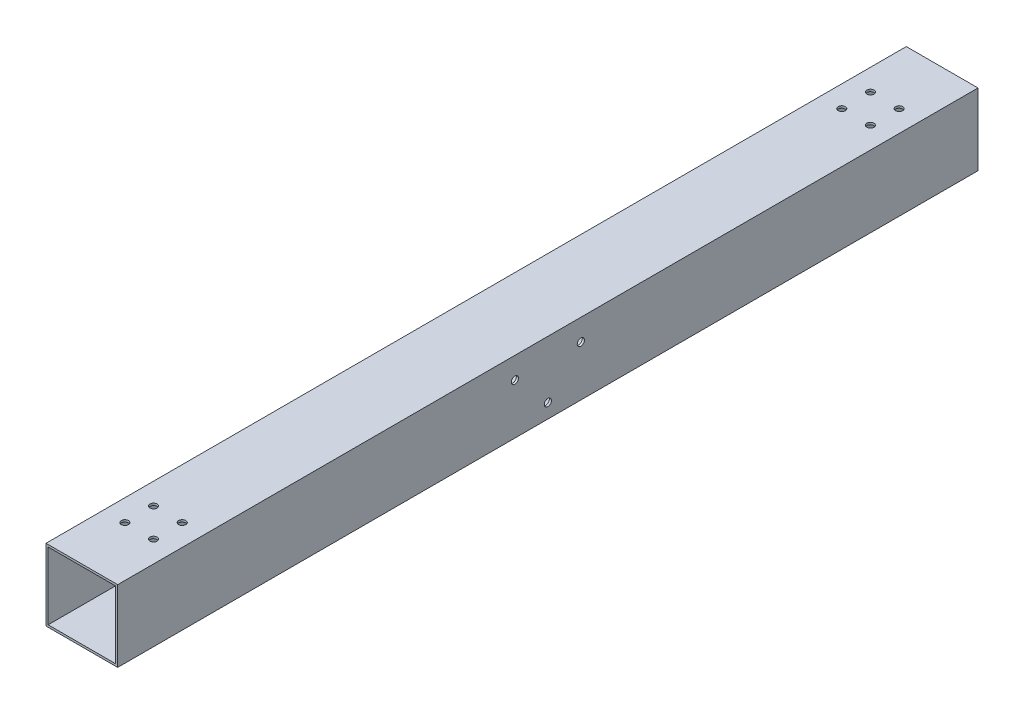
ISO-10303-21;
HEADER;
FILE_DESCRIPTION(('STEP AP214'),'2;1');
FILE_NAME('part.step','',(''),(''),'','','');
FILE_SCHEMA(('AUTOMOTIVE_DESIGN { 1 0 10303 214 1 1 1 1 }'));
ENDSEC;
DATA;
#1=APPLICATION_CONTEXT('core data for automotive mechanical design processes');
#2=APPLICATION_PROTOCOL_DEFINITION('international standard','automotive_design',2000,#1);
#3=PRODUCT_CONTEXT('',#1,'mechanical');
#4=PRODUCT('Part','Part','',(#3));
#5=PRODUCT_RELATED_PRODUCT_CATEGORY('part','',(#4));
#6=PRODUCT_DEFINITION_FORMATION('','',#4);
#7=PRODUCT_DEFINITION_CONTEXT('part definition',#1,'design');
#8=PRODUCT_DEFINITION('design','',#6,#7);
#9=PRODUCT_DEFINITION_SHAPE('','',#8);
#10=(LENGTH_UNIT() NAMED_UNIT(*) SI_UNIT(.MILLI.,.METRE.));
#11=(NAMED_UNIT(*) PLANE_ANGLE_UNIT() SI_UNIT($,.RADIAN.));
#12=(NAMED_UNIT(*) SI_UNIT($,.STERADIAN.) SOLID_ANGLE_UNIT());
#13=UNCERTAINTY_MEASURE_WITH_UNIT(LENGTH_MEASURE(1.E-05),#10,'distance_accuracy_value','');
#14=(GEOMETRIC_REPRESENTATION_CONTEXT(3) GLOBAL_UNCERTAINTY_ASSIGNED_CONTEXT((#13)) GLOBAL_UNIT_ASSIGNED_CONTEXT((#10,
#11,#12)) REPRESENTATION_CONTEXT('',''));
#15=CARTESIAN_POINT('',(0.,0.,0.));
#16=DIRECTION('',(0.,0.,1.));
#17=DIRECTION('',(1.,0.,0.));
#18=AXIS2_PLACEMENT_3D('',#15,#16,#17);
#19=CARTESIAN_POINT('',(0.,0.,600.));
#20=DIRECTION('',(0.,0.,1.));
#21=DIRECTION('',(1.,0.,0.));
#22=AXIS2_PLACEMENT_3D('',#19,#20,#21);
#23=PLANE('',#22);
#24=DIRECTION('',(0.,1.,0.));
#25=VECTOR('',#24,1.);
#26=CARTESIAN_POINT('',(25.,25.,600.));
#27=LINE('',#26,#25);
#28=CARTESIAN_POINT('',(25.,-25.,600.));
#29=VERTEX_POINT('',#28);
#30=CARTESIAN_POINT('',(25.,25.,600.));
#31=VERTEX_POINT('',#30);
#32=EDGE_CURVE('E140',#29,#31,#27,.T.);
#33=ORIENTED_EDGE('',*,*,#32,.T.);
#34=DIRECTION('',(-1.,0.,0.));
#35=VECTOR('',#34,1.);
#36=CARTESIAN_POINT('',(-25.,25.,600.));
#37=LINE('',#36,#35);
#38=CARTESIAN_POINT('',(-25.,25.,600.));
#39=VERTEX_POINT('',#38);
#40=EDGE_CURVE('E143',#31,#39,#37,.T.);
#41=ORIENTED_EDGE('',*,*,#40,.T.);
#42=DIRECTION('',(0.,-1.,0.));
#43=VECTOR('',#42,1.);
#44=CARTESIAN_POINT('',(-25.,25.,600.));
#45=LINE('',#44,#43);
#46=CARTESIAN_POINT('',(-25.,-25.,600.));
#47=VERTEX_POINT('',#46);
#48=EDGE_CURVE('E146',#39,#47,#45,.T.);
#49=ORIENTED_EDGE('',*,*,#48,.T.);
#50=DIRECTION('',(1.,0.,0.));
#51=VECTOR('',#50,1.);
#52=CARTESIAN_POINT('',(-25.,-25.,600.));
#53=LINE('',#52,#51);
#54=EDGE_CURVE('E148',#47,#29,#53,.T.);
#55=ORIENTED_EDGE('',*,*,#54,.T.);
#56=EDGE_LOOP('',(#33,#41,#49,#55));
#57=FACE_BOUND('',#56,.T.);
#58=DIRECTION('',(-1.,0.,0.));
#59=VECTOR('',#58,1.);
#60=CARTESIAN_POINT('',(-23.5,23.5,600.));
#61=LINE('',#60,#59);
#62=CARTESIAN_POINT('',(23.5,23.5,600.));
#63=VERTEX_POINT('',#62);
#64=CARTESIAN_POINT('',(-23.5,23.5,600.));
#65=VERTEX_POINT('',#64);
#66=EDGE_CURVE('E110',#63,#65,#61,.T.);
#67=ORIENTED_EDGE('',*,*,#66,.F.);
#68=DIRECTION('',(0.,1.,0.));
#69=VECTOR('',#68,1.);
#70=CARTESIAN_POINT('',(23.5,23.5,600.));
#71=LINE('',#70,#69);
#72=CARTESIAN_POINT('',(23.5,-23.5,600.));
#73=VERTEX_POINT('',#72);
#74=EDGE_CURVE('E102',#73,#63,#71,.T.);
#75=ORIENTED_EDGE('',*,*,#74,.F.);
#76=DIRECTION('',(1.,0.,0.));
#77=VECTOR('',#76,1.);
#78=CARTESIAN_POINT('',(-23.5,-23.5,600.));
#79=LINE('',#78,#77);
#80=CARTESIAN_POINT('',(-23.5,-23.5,600.));
#81=VERTEX_POINT('',#80);
#82=EDGE_CURVE('E124',#81,#73,#79,.T.);
#83=ORIENTED_EDGE('',*,*,#82,.F.);
#84=DIRECTION('',(0.,-1.,0.));
#85=VECTOR('',#84,1.);
#86=CARTESIAN_POINT('',(-23.5,23.5,600.));
#87=LINE('',#86,#85);
#88=EDGE_CURVE('E122',#65,#81,#87,.T.);
#89=ORIENTED_EDGE('',*,*,#88,.F.);
#90=EDGE_LOOP('',(#67,#75,#83,#89));
#91=FACE_BOUND('',#90,.T.);
#92=ADVANCED_FACE('F35',(#57,#91),#23,.T.);
#93=CARTESIAN_POINT('',(0.,0.,0.));
#94=DIRECTION('',(0.,0.,1.));
#95=DIRECTION('',(1.,0.,0.));
#96=AXIS2_PLACEMENT_3D('',#93,#94,#95);
#97=PLANE('',#96);
#98=DIRECTION('',(0.,1.,0.));
#99=VECTOR('',#98,1.);
#100=CARTESIAN_POINT('',(25.,25.,0.));
#101=LINE('',#100,#99);
#102=CARTESIAN_POINT('',(25.,-25.,0.));
#103=VERTEX_POINT('',#102);
#104=CARTESIAN_POINT('',(25.,25.,0.));
#105=VERTEX_POINT('',#104);
#106=EDGE_CURVE('E118',#103,#105,#101,.T.);
#107=ORIENTED_EDGE('',*,*,#106,.F.);
#108=DIRECTION('',(1.,0.,0.));
#109=VECTOR('',#108,1.);
#110=CARTESIAN_POINT('',(-25.,-25.,0.));
#111=LINE('',#110,#109);
#112=CARTESIAN_POINT('',(-25.,-25.,0.));
#113=VERTEX_POINT('',#112);
#114=EDGE_CURVE('E144',#113,#103,#111,.T.);
#115=ORIENTED_EDGE('',*,*,#114,.F.);
#116=DIRECTION('',(0.,-1.,0.));
#117=VECTOR('',#116,1.);
#118=CARTESIAN_POINT('',(-25.,25.,0.));
#119=LINE('',#118,#117);
#120=CARTESIAN_POINT('',(-25.,25.,0.));
#121=VERTEX_POINT('',#120);
#122=EDGE_CURVE('E155',#121,#113,#119,.T.);
#123=ORIENTED_EDGE('',*,*,#122,.F.);
#124=DIRECTION('',(-1.,0.,0.));
#125=VECTOR('',#124,1.);
#126=CARTESIAN_POINT('',(-25.,25.,0.));
#127=LINE('',#126,#125);
#128=EDGE_CURVE('E153',#105,#121,#127,.T.);
#129=ORIENTED_EDGE('',*,*,#128,.F.);
#130=EDGE_LOOP('',(#107,#115,#123,#129));
#131=FACE_BOUND('',#130,.T.);
#132=DIRECTION('',(0.,1.,0.));
#133=VECTOR('',#132,1.);
#134=CARTESIAN_POINT('',(23.5,23.5,0.));
#135=LINE('',#134,#133);
#136=CARTESIAN_POINT('',(23.5,-23.5,0.));
#137=VERTEX_POINT('',#136);
#138=CARTESIAN_POINT('',(23.5,23.5,0.));
#139=VERTEX_POINT('',#138);
#140=EDGE_CURVE('E60',#137,#139,#135,.T.);
#141=ORIENTED_EDGE('',*,*,#140,.T.);
#142=DIRECTION('',(-1.,0.,0.));
#143=VECTOR('',#142,1.);
#144=CARTESIAN_POINT('',(-23.5,23.5,0.));
#145=LINE('',#144,#143);
#146=CARTESIAN_POINT('',(-23.5,23.5,0.));
#147=VERTEX_POINT('',#146);
#148=EDGE_CURVE('E117',#139,#147,#145,.T.);
#149=ORIENTED_EDGE('',*,*,#148,.T.);
#150=DIRECTION('',(0.,-1.,0.));
#151=VECTOR('',#150,1.);
#152=CARTESIAN_POINT('',(-23.5,23.5,0.));
#153=LINE('',#152,#151);
#154=CARTESIAN_POINT('',(-23.5,-23.5,0.));
#155=VERTEX_POINT('',#154);
#156=EDGE_CURVE('E132',#147,#155,#153,.T.);
#157=ORIENTED_EDGE('',*,*,#156,.T.);
#158=DIRECTION('',(1.,0.,0.));
#159=VECTOR('',#158,1.);
#160=CARTESIAN_POINT('',(-23.5,-23.5,0.));
#161=LINE('',#160,#159);
#162=EDGE_CURVE('E111',#155,#137,#161,.T.);
#163=ORIENTED_EDGE('',*,*,#162,.T.);
#164=EDGE_LOOP('',(#141,#149,#157,#163));
#165=FACE_BOUND('',#164,.T.);
#166=ADVANCED_FACE('F266',(#131,#165),#97,.F.);
#167=CARTESIAN_POINT('',(25.,25.,600.));
#168=DIRECTION('',(-1.,0.,0.));
#169=DIRECTION('',(0.,-1.,0.));
#170=AXIS2_PLACEMENT_3D('',#167,#168,#169);
#171=PLANE('',#170);
#172=CARTESIAN_POINT('',(25.,-14.9999999999999,300.));
#173=DIRECTION('',(1.,0.,0.));
#174=DIRECTION('',(0.,1.,0.));
#175=AXIS2_PLACEMENT_3D('',#172,#173,#174);
#176=CIRCLE('',#175,2.50000000000002);
#177=CARTESIAN_POINT('',(25.,-12.4999999999999,300.));
#178=VERTEX_POINT('',#177);
#179=EDGE_CURVE('E169',#178,#178,#176,.T.);
#180=ORIENTED_EDGE('',*,*,#179,.F.);
#181=EDGE_LOOP('',(#180));
#182=FACE_BOUND('',#181,.T.);
#183=CARTESIAN_POINT('',(25.,10.,277.));
#184=DIRECTION('',(1.,0.,0.));
#185=DIRECTION('',(0.,1.,0.));
#186=AXIS2_PLACEMENT_3D('',#183,#184,#185);
#187=CIRCLE('',#186,2.50000000000002);
#188=CARTESIAN_POINT('',(25.,12.5000000000001,277.));
#189=VERTEX_POINT('',#188);
#190=EDGE_CURVE('E224',#189,#189,#187,.T.);
#191=ORIENTED_EDGE('',*,*,#190,.F.);
#192=EDGE_LOOP('',(#191));
#193=FACE_BOUND('',#192,.T.);
#194=CARTESIAN_POINT('',(25.,10.,323.));
#195=DIRECTION('',(1.,0.,0.));
#196=DIRECTION('',(0.,-1.,0.));
#197=AXIS2_PLACEMENT_3D('',#194,#195,#196);
#198=CIRCLE('',#197,2.50000000000002);
#199=CARTESIAN_POINT('',(25.,7.50000000000003,323.));
#200=VERTEX_POINT('',#199);
#201=EDGE_CURVE('E221',#200,#200,#198,.T.);
#202=ORIENTED_EDGE('',*,*,#201,.F.);
#203=EDGE_LOOP('',(#202));
#204=FACE_BOUND('',#203,.T.);
#205=ORIENTED_EDGE('',*,*,#106,.T.);
#206=DIRECTION('',(0.,0.,-1.));
#207=VECTOR('',#206,1.);
#208=CARTESIAN_POINT('',(25.,25.,600.));
#209=LINE('',#208,#207);
#210=EDGE_CURVE('E11',#31,#105,#209,.T.);
#211=ORIENTED_EDGE('',*,*,#210,.F.);
#212=ORIENTED_EDGE('',*,*,#32,.F.);
#213=DIRECTION('',(0.,0.,-1.));
#214=VECTOR('',#213,1.);
#215=CARTESIAN_POINT('',(25.,-25.,600.));
#216=LINE('',#215,#214);
#217=EDGE_CURVE('E150',#29,#103,#216,.T.);
#218=ORIENTED_EDGE('',*,*,#217,.T.);
#219=EDGE_LOOP('',(#205,#211,#212,#218));
#220=FACE_BOUND('',#219,.T.);
#221=ADVANCED_FACE('F37',(#182,#193,#204,#220),#171,.F.);
#222=CARTESIAN_POINT('',(-25.,25.,600.));
#223=DIRECTION('',(0.,-1.,0.));
#224=DIRECTION('',(0.,0.,-1.));
#225=AXIS2_PLACEMENT_3D('',#222,#223,#224);
#226=PLANE('',#225);
#227=CARTESIAN_POINT('',(10.,25.,540.));
#228=DIRECTION('',(0.,1.,0.));
#229=DIRECTION('',(0.,0.,1.));
#230=AXIS2_PLACEMENT_3D('',#227,#228,#229);
#231=CIRCLE('',#230,2.5);
#232=CARTESIAN_POINT('',(10.,25.,542.5));
#233=VERTEX_POINT('',#232);
#234=EDGE_CURVE('E292',#233,#233,#231,.T.);
#235=ORIENTED_EDGE('',*,*,#234,.F.);
#236=EDGE_LOOP('',(#235));
#237=FACE_BOUND('',#236,.T.);
#238=CARTESIAN_POINT('',(10.,25.,60.));
#239=DIRECTION('',(0.,1.,0.));
#240=DIRECTION('',(0.,0.,-1.));
#241=AXIS2_PLACEMENT_3D('',#238,#239,#240);
#242=CIRCLE('',#241,2.5);
#243=CARTESIAN_POINT('',(10.,25.,57.5));
#244=VERTEX_POINT('',#243);
#245=EDGE_CURVE('E296',#244,#244,#242,.T.);
#246=ORIENTED_EDGE('',*,*,#245,.F.);
#247=EDGE_LOOP('',(#246));
#248=FACE_BOUND('',#247,.T.);
#249=CARTESIAN_POINT('',(-9.99999999999999,25.,60.));
#250=DIRECTION('',(0.,1.,0.));
#251=DIRECTION('',(0.,0.,1.));
#252=AXIS2_PLACEMENT_3D('',#249,#250,#251);
#253=CIRCLE('',#252,2.5);
#254=CARTESIAN_POINT('',(-9.99999999999999,25.,62.5));
#255=VERTEX_POINT('',#254);
#256=EDGE_CURVE('E300',#255,#255,#253,.T.);
#257=ORIENTED_EDGE('',*,*,#256,.F.);
#258=EDGE_LOOP('',(#257));
#259=FACE_BOUND('',#258,.T.);
#260=CARTESIAN_POINT('',(10.,25.,40.));
#261=DIRECTION('',(0.,1.,0.));
#262=DIRECTION('',(0.,0.,-1.));
#263=AXIS2_PLACEMENT_3D('',#260,#261,#262);
#264=CIRCLE('',#263,2.5);
#265=CARTESIAN_POINT('',(10.,25.,37.5));
#266=VERTEX_POINT('',#265);
#267=EDGE_CURVE('E304',#266,#266,#264,.T.);
#268=ORIENTED_EDGE('',*,*,#267,.F.);
#269=EDGE_LOOP('',(#268));
#270=FACE_BOUND('',#269,.T.);
#271=CARTESIAN_POINT('',(-9.99999999999999,25.,560.));
#272=DIRECTION('',(0.,1.,0.));
#273=DIRECTION('',(0.,0.,-1.));
#274=AXIS2_PLACEMENT_3D('',#271,#272,#273);
#275=CIRCLE('',#274,2.5);
#276=CARTESIAN_POINT('',(-9.99999999999999,25.,557.5));
#277=VERTEX_POINT('',#276);
#278=EDGE_CURVE('E308',#277,#277,#275,.T.);
#279=ORIENTED_EDGE('',*,*,#278,.F.);
#280=EDGE_LOOP('',(#279));
#281=FACE_BOUND('',#280,.T.);
#282=CARTESIAN_POINT('',(10.,25.,560.));
#283=DIRECTION('',(0.,1.,0.));
#284=DIRECTION('',(0.,0.,1.));
#285=AXIS2_PLACEMENT_3D('',#282,#283,#284);
#286=CIRCLE('',#285,2.5);
#287=CARTESIAN_POINT('',(10.,25.,562.5));
#288=VERTEX_POINT('',#287);
#289=EDGE_CURVE('E312',#288,#288,#286,.T.);
#290=ORIENTED_EDGE('',*,*,#289,.F.);
#291=EDGE_LOOP('',(#290));
#292=FACE_BOUND('',#291,.T.);
#293=CARTESIAN_POINT('',(-9.99999999999999,25.,540.));
#294=DIRECTION('',(0.,1.,0.));
#295=DIRECTION('',(0.,0.,-1.));
#296=AXIS2_PLACEMENT_3D('',#293,#294,#295);
#297=CIRCLE('',#296,2.5);
#298=CARTESIAN_POINT('',(-9.99999999999999,25.,537.5));
#299=VERTEX_POINT('',#298);
#300=EDGE_CURVE('E316',#299,#299,#297,.T.);
#301=ORIENTED_EDGE('',*,*,#300,.F.);
#302=EDGE_LOOP('',(#301));
#303=FACE_BOUND('',#302,.T.);
#304=CARTESIAN_POINT('',(-9.99999999999999,25.,40.));
#305=DIRECTION('',(0.,1.,0.));
#306=DIRECTION('',(0.,0.,1.));
#307=AXIS2_PLACEMENT_3D('',#304,#305,#306);
#308=CIRCLE('',#307,2.5);
#309=CARTESIAN_POINT('',(-9.99999999999999,25.,42.5));
#310=VERTEX_POINT('',#309);
#311=EDGE_CURVE('E320',#310,#310,#308,.T.);
#312=ORIENTED_EDGE('',*,*,#311,.F.);
#313=EDGE_LOOP('',(#312));
#314=FACE_BOUND('',#313,.T.);
#315=ORIENTED_EDGE('',*,*,#128,.T.);
#316=DIRECTION('',(0.,0.,-1.));
#317=VECTOR('',#316,1.);
#318=CARTESIAN_POINT('',(-25.,25.,600.));
#319=LINE('',#318,#317);
#320=EDGE_CURVE('E44',#39,#121,#319,.T.);
#321=ORIENTED_EDGE('',*,*,#320,.F.);
#322=ORIENTED_EDGE('',*,*,#40,.F.);
#323=ORIENTED_EDGE('',*,*,#210,.T.);
#324=EDGE_LOOP('',(#315,#321,#322,#323));
#325=FACE_BOUND('',#324,.T.);
#326=ADVANCED_FACE('F282',(#237,#248,#259,#270,#281,#292,#303,#314,#325),#226,.F.);
#327=CARTESIAN_POINT('',(-25.,25.,600.));
#328=DIRECTION('',(1.,0.,0.));
#329=DIRECTION('',(0.,1.,0.));
#330=AXIS2_PLACEMENT_3D('',#327,#328,#329);
#331=PLANE('',#330);
#332=CARTESIAN_POINT('',(-25.,-15.,300.));
#333=DIRECTION('',(1.,0.,0.));
#334=DIRECTION('',(0.,1.,0.));
#335=AXIS2_PLACEMENT_3D('',#332,#333,#334);
#336=CIRCLE('',#335,2.50000000000002);
#337=CARTESIAN_POINT('',(-25.,-12.4999999999999,300.));
#338=VERTEX_POINT('',#337);
#339=EDGE_CURVE('E130',#338,#338,#336,.T.);
#340=ORIENTED_EDGE('',*,*,#339,.T.);
#341=EDGE_LOOP('',(#340));
#342=FACE_BOUND('',#341,.T.);
#343=CARTESIAN_POINT('',(-25.,10.,277.));
#344=DIRECTION('',(1.,0.,0.));
#345=DIRECTION('',(0.,1.,0.));
#346=AXIS2_PLACEMENT_3D('',#343,#344,#345);
#347=CIRCLE('',#346,2.50000000000002);
#348=CARTESIAN_POINT('',(-25.,12.5000000000001,277.));
#349=VERTEX_POINT('',#348);
#350=EDGE_CURVE('E179',#349,#349,#347,.T.);
#351=ORIENTED_EDGE('',*,*,#350,.T.);
#352=EDGE_LOOP('',(#351));
#353=FACE_BOUND('',#352,.T.);
#354=CARTESIAN_POINT('',(-25.,10.,323.));
#355=DIRECTION('',(1.,0.,0.));
#356=DIRECTION('',(0.,1.,0.));
#357=AXIS2_PLACEMENT_3D('',#354,#355,#356);
#358=CIRCLE('',#357,2.50000000000002);
#359=CARTESIAN_POINT('',(-25.,12.5000000000001,323.));
#360=VERTEX_POINT('',#359);
#361=EDGE_CURVE('E174',#360,#360,#358,.T.);
#362=ORIENTED_EDGE('',*,*,#361,.T.);
#363=EDGE_LOOP('',(#362));
#364=FACE_BOUND('',#363,.T.);
#365=ORIENTED_EDGE('',*,*,#122,.T.);
#366=DIRECTION('',(0.,0.,-1.));
#367=VECTOR('',#366,1.);
#368=CARTESIAN_POINT('',(-25.,-25.,600.));
#369=LINE('',#368,#367);
#370=EDGE_CURVE('E160',#47,#113,#369,.T.);
#371=ORIENTED_EDGE('',*,*,#370,.F.);
#372=ORIENTED_EDGE('',*,*,#48,.F.);
#373=ORIENTED_EDGE('',*,*,#320,.T.);
#374=EDGE_LOOP('',(#365,#371,#372,#373));
#375=FACE_BOUND('',#374,.T.);
#376=ADVANCED_FACE('F241',(#342,#353,#364,#375),#331,.F.);
#377=CARTESIAN_POINT('',(-25.,-25.,600.));
#378=DIRECTION('',(0.,1.,0.));
#379=DIRECTION('',(0.,0.,1.));
#380=AXIS2_PLACEMENT_3D('',#377,#378,#379);
#381=PLANE('',#380);
#382=CARTESIAN_POINT('',(10.,-25.,540.));
#383=DIRECTION('',(0.,1.,0.));
#384=DIRECTION('',(0.,0.,1.));
#385=AXIS2_PLACEMENT_3D('',#382,#383,#384);
#386=CIRCLE('',#385,2.5);
#387=CARTESIAN_POINT('',(10.,-25.,542.5));
#388=VERTEX_POINT('',#387);
#389=EDGE_CURVE('E406',#388,#388,#386,.T.);
#390=ORIENTED_EDGE('',*,*,#389,.T.);
#391=EDGE_LOOP('',(#390));
#392=FACE_BOUND('',#391,.T.);
#393=CARTESIAN_POINT('',(10.,-25.,60.));
#394=DIRECTION('',(0.,1.,0.));
#395=DIRECTION('',(0.,0.,-1.));
#396=AXIS2_PLACEMENT_3D('',#393,#394,#395);
#397=CIRCLE('',#396,2.5);
#398=CARTESIAN_POINT('',(10.,-25.,57.5));
#399=VERTEX_POINT('',#398);
#400=EDGE_CURVE('E402',#399,#399,#397,.T.);
#401=ORIENTED_EDGE('',*,*,#400,.T.);
#402=EDGE_LOOP('',(#401));
#403=FACE_BOUND('',#402,.T.);
#404=CARTESIAN_POINT('',(-9.99999999999999,-25.,60.));
#405=DIRECTION('',(0.,1.,0.));
#406=DIRECTION('',(0.,0.,1.));
#407=AXIS2_PLACEMENT_3D('',#404,#405,#406);
#408=CIRCLE('',#407,2.5);
#409=CARTESIAN_POINT('',(-9.99999999999999,-25.,62.5));
#410=VERTEX_POINT('',#409);
#411=EDGE_CURVE('E414',#410,#410,#408,.T.);
#412=ORIENTED_EDGE('',*,*,#411,.T.);
#413=EDGE_LOOP('',(#412));
#414=FACE_BOUND('',#413,.T.);
#415=CARTESIAN_POINT('',(10.,-25.,40.));
#416=DIRECTION('',(0.,1.,0.));
#417=DIRECTION('',(0.,0.,-1.));
#418=AXIS2_PLACEMENT_3D('',#415,#416,#417);
#419=CIRCLE('',#418,2.5);
#420=CARTESIAN_POINT('',(10.,-25.,37.5));
#421=VERTEX_POINT('',#420);
#422=EDGE_CURVE('E410',#421,#421,#419,.T.);
#423=ORIENTED_EDGE('',*,*,#422,.T.);
#424=EDGE_LOOP('',(#423));
#425=FACE_BOUND('',#424,.T.);
#426=CARTESIAN_POINT('',(-9.99999999999999,-25.,560.));
#427=DIRECTION('',(0.,1.,0.));
#428=DIRECTION('',(0.,0.,-1.));
#429=AXIS2_PLACEMENT_3D('',#426,#427,#428);
#430=CIRCLE('',#429,2.5);
#431=CARTESIAN_POINT('',(-9.99999999999999,-25.,557.5));
#432=VERTEX_POINT('',#431);
#433=EDGE_CURVE('E389',#432,#432,#430,.T.);
#434=ORIENTED_EDGE('',*,*,#433,.T.);
#435=EDGE_LOOP('',(#434));
#436=FACE_BOUND('',#435,.T.);
#437=CARTESIAN_POINT('',(10.,-25.,560.));
#438=DIRECTION('',(0.,1.,0.));
#439=DIRECTION('',(0.,0.,1.));
#440=AXIS2_PLACEMENT_3D('',#437,#438,#439);
#441=CIRCLE('',#440,2.5);
#442=CARTESIAN_POINT('',(10.,-25.,562.5));
#443=VERTEX_POINT('',#442);
#444=EDGE_CURVE('E398',#443,#443,#441,.T.);
#445=ORIENTED_EDGE('',*,*,#444,.T.);
#446=EDGE_LOOP('',(#445));
#447=FACE_BOUND('',#446,.T.);
#448=CARTESIAN_POINT('',(-9.99999999999999,-25.,540.));
#449=DIRECTION('',(0.,1.,0.));
#450=DIRECTION('',(0.,0.,-1.));
#451=AXIS2_PLACEMENT_3D('',#448,#449,#450);
#452=CIRCLE('',#451,2.5);
#453=CARTESIAN_POINT('',(-9.99999999999999,-25.,537.5));
#454=VERTEX_POINT('',#453);
#455=EDGE_CURVE('E394',#454,#454,#452,.T.);
#456=ORIENTED_EDGE('',*,*,#455,.T.);
#457=EDGE_LOOP('',(#456));
#458=FACE_BOUND('',#457,.T.);
#459=CARTESIAN_POINT('',(-9.99999999999999,-25.,40.));
#460=DIRECTION('',(0.,1.,0.));
#461=DIRECTION('',(0.,0.,1.));
#462=AXIS2_PLACEMENT_3D('',#459,#460,#461);
#463=CIRCLE('',#462,2.5);
#464=CARTESIAN_POINT('',(-9.99999999999999,-25.,42.5));
#465=VERTEX_POINT('',#464);
#466=EDGE_CURVE('E184',#465,#465,#463,.T.);
#467=ORIENTED_EDGE('',*,*,#466,.T.);
#468=EDGE_LOOP('',(#467));
#469=FACE_BOUND('',#468,.T.);
#470=ORIENTED_EDGE('',*,*,#114,.T.);
#471=ORIENTED_EDGE('',*,*,#217,.F.);
#472=ORIENTED_EDGE('',*,*,#54,.F.);
#473=ORIENTED_EDGE('',*,*,#370,.T.);
#474=EDGE_LOOP('',(#470,#471,#472,#473));
#475=FACE_BOUND('',#474,.T.);
#476=ADVANCED_FACE('F277',(#392,#403,#414,#425,#436,#447,#458,#469,#475),#381,.F.);
#477=CARTESIAN_POINT('',(23.5,23.5,600.));
#478=DIRECTION('',(-1.,0.,0.));
#479=DIRECTION('',(0.,-1.,0.));
#480=AXIS2_PLACEMENT_3D('',#477,#478,#479);
#481=PLANE('',#480);
#482=CARTESIAN_POINT('',(23.5,-14.9999999999999,300.));
#483=DIRECTION('',(-1.,0.,0.));
#484=DIRECTION('',(0.,-1.,0.));
#485=AXIS2_PLACEMENT_3D('',#482,#483,#484);
#486=CIRCLE('',#485,2.50000000000002);
#487=CARTESIAN_POINT('',(23.5,-17.5,300.));
#488=VERTEX_POINT('',#487);
#489=EDGE_CURVE('E178',#488,#488,#486,.T.);
#490=ORIENTED_EDGE('',*,*,#489,.F.);
#491=EDGE_LOOP('',(#490));
#492=FACE_BOUND('',#491,.T.);
#493=CARTESIAN_POINT('',(23.5,10.,277.));
#494=DIRECTION('',(-1.,0.,0.));
#495=DIRECTION('',(0.,-1.,0.));
#496=AXIS2_PLACEMENT_3D('',#493,#494,#495);
#497=CIRCLE('',#496,2.50000000000002);
#498=CARTESIAN_POINT('',(23.5,7.50000000000003,277.));
#499=VERTEX_POINT('',#498);
#500=EDGE_CURVE('E173',#499,#499,#497,.T.);
#501=ORIENTED_EDGE('',*,*,#500,.F.);
#502=EDGE_LOOP('',(#501));
#503=FACE_BOUND('',#502,.T.);
#504=CARTESIAN_POINT('',(23.5,10.,323.));
#505=DIRECTION('',(-1.,0.,0.));
#506=DIRECTION('',(0.,-1.,0.));
#507=AXIS2_PLACEMENT_3D('',#504,#505,#506);
#508=CIRCLE('',#507,2.50000000000002);
#509=CARTESIAN_POINT('',(23.5,7.50000000000003,323.));
#510=VERTEX_POINT('',#509);
#511=EDGE_CURVE('E168',#510,#510,#508,.T.);
#512=ORIENTED_EDGE('',*,*,#511,.F.);
#513=EDGE_LOOP('',(#512));
#514=FACE_BOUND('',#513,.T.);
#515=ORIENTED_EDGE('',*,*,#140,.F.);
#516=DIRECTION('',(0.,0.,-1.));
#517=VECTOR('',#516,1.);
#518=CARTESIAN_POINT('',(23.5,-23.5,600.));
#519=LINE('',#518,#517);
#520=EDGE_CURVE('E106',#73,#137,#519,.T.);
#521=ORIENTED_EDGE('',*,*,#520,.F.);
#522=ORIENTED_EDGE('',*,*,#74,.T.);
#523=DIRECTION('',(0.,0.,-1.));
#524=VECTOR('',#523,1.);
#525=CARTESIAN_POINT('',(23.5,23.5,600.));
#526=LINE('',#525,#524);
#527=EDGE_CURVE('E105',#63,#139,#526,.T.);
#528=ORIENTED_EDGE('',*,*,#527,.T.);
#529=EDGE_LOOP('',(#515,#521,#522,#528));
#530=FACE_BOUND('',#529,.T.);
#531=ADVANCED_FACE('F104',(#492,#503,#514,#530),#481,.T.);
#532=CARTESIAN_POINT('',(-23.5,23.5,600.));
#533=DIRECTION('',(0.,-1.,0.));
#534=DIRECTION('',(0.,0.,-1.));
#535=AXIS2_PLACEMENT_3D('',#532,#533,#534);
#536=PLANE('',#535);
#537=CARTESIAN_POINT('',(10.,23.5,540.));
#538=DIRECTION('',(0.,-1.,0.));
#539=DIRECTION('',(0.,0.,-1.));
#540=AXIS2_PLACEMENT_3D('',#537,#538,#539);
#541=CIRCLE('',#540,2.5);
#542=CARTESIAN_POINT('',(10.,23.5,537.5));
#543=VERTEX_POINT('',#542);
#544=EDGE_CURVE('E218',#543,#543,#541,.T.);
#545=ORIENTED_EDGE('',*,*,#544,.F.);
#546=EDGE_LOOP('',(#545));
#547=FACE_BOUND('',#546,.T.);
#548=CARTESIAN_POINT('',(10.,23.5,60.));
#549=DIRECTION('',(0.,-1.,0.));
#550=DIRECTION('',(0.,0.,-1.));
#551=AXIS2_PLACEMENT_3D('',#548,#549,#550);
#552=CIRCLE('',#551,2.5);
#553=CARTESIAN_POINT('',(10.,23.5,57.5));
#554=VERTEX_POINT('',#553);
#555=EDGE_CURVE('E206',#554,#554,#552,.T.);
#556=ORIENTED_EDGE('',*,*,#555,.F.);
#557=EDGE_LOOP('',(#556));
#558=FACE_BOUND('',#557,.T.);
#559=CARTESIAN_POINT('',(-9.99999999999999,23.5,60.));
#560=DIRECTION('',(0.,-1.,0.));
#561=DIRECTION('',(0.,0.,-1.));
#562=AXIS2_PLACEMENT_3D('',#559,#560,#561);
#563=CIRCLE('',#562,2.5);
#564=CARTESIAN_POINT('',(-9.99999999999999,23.5,57.5));
#565=VERTEX_POINT('',#564);
#566=EDGE_CURVE('E203',#565,#565,#563,.T.);
#567=ORIENTED_EDGE('',*,*,#566,.F.);
#568=EDGE_LOOP('',(#567));
#569=FACE_BOUND('',#568,.T.);
#570=CARTESIAN_POINT('',(10.,23.5,40.));
#571=DIRECTION('',(0.,-1.,0.));
#572=DIRECTION('',(0.,0.,-1.));
#573=AXIS2_PLACEMENT_3D('',#570,#571,#572);
#574=CIRCLE('',#573,2.5);
#575=CARTESIAN_POINT('',(10.,23.5,37.5));
#576=VERTEX_POINT('',#575);
#577=EDGE_CURVE('E200',#576,#576,#574,.T.);
#578=ORIENTED_EDGE('',*,*,#577,.F.);
#579=EDGE_LOOP('',(#578));
#580=FACE_BOUND('',#579,.T.);
#581=CARTESIAN_POINT('',(-9.99999999999999,23.5,560.));
#582=DIRECTION('',(0.,-1.,0.));
#583=DIRECTION('',(0.,0.,-1.));
#584=AXIS2_PLACEMENT_3D('',#581,#582,#583);
#585=CIRCLE('',#584,2.5);
#586=CARTESIAN_POINT('',(-9.99999999999999,23.5,557.5));
#587=VERTEX_POINT('',#586);
#588=EDGE_CURVE('E196',#587,#587,#585,.T.);
#589=ORIENTED_EDGE('',*,*,#588,.F.);
#590=EDGE_LOOP('',(#589));
#591=FACE_BOUND('',#590,.T.);
#592=CARTESIAN_POINT('',(10.,23.5,560.));
#593=DIRECTION('',(0.,-1.,0.));
#594=DIRECTION('',(0.,0.,-1.));
#595=AXIS2_PLACEMENT_3D('',#592,#593,#594);
#596=CIRCLE('',#595,2.5);
#597=CARTESIAN_POINT('',(10.,23.5,557.5));
#598=VERTEX_POINT('',#597);
#599=EDGE_CURVE('E192',#598,#598,#596,.T.);
#600=ORIENTED_EDGE('',*,*,#599,.F.);
#601=EDGE_LOOP('',(#600));
#602=FACE_BOUND('',#601,.T.);
#603=CARTESIAN_POINT('',(-9.99999999999999,23.5,540.));
#604=DIRECTION('',(0.,-1.,0.));
#605=DIRECTION('',(0.,0.,-1.));
#606=AXIS2_PLACEMENT_3D('',#603,#604,#605);
#607=CIRCLE('',#606,2.5);
#608=CARTESIAN_POINT('',(-9.99999999999999,23.5,537.5));
#609=VERTEX_POINT('',#608);
#610=EDGE_CURVE('E188',#609,#609,#607,.T.);
#611=ORIENTED_EDGE('',*,*,#610,.F.);
#612=EDGE_LOOP('',(#611));
#613=FACE_BOUND('',#612,.T.);
#614=CARTESIAN_POINT('',(-9.99999999999999,23.5,40.));
#615=DIRECTION('',(0.,-1.,0.));
#616=DIRECTION('',(0.,0.,-1.));
#617=AXIS2_PLACEMENT_3D('',#614,#615,#616);
#618=CIRCLE('',#617,2.5);
#619=CARTESIAN_POINT('',(-9.99999999999999,23.5,37.5));
#620=VERTEX_POINT('',#619);
#621=EDGE_CURVE('E183',#620,#620,#618,.T.);
#622=ORIENTED_EDGE('',*,*,#621,.F.);
#623=EDGE_LOOP('',(#622));
#624=FACE_BOUND('',#623,.T.);
#625=ORIENTED_EDGE('',*,*,#148,.F.);
#626=ORIENTED_EDGE('',*,*,#527,.F.);
#627=ORIENTED_EDGE('',*,*,#66,.T.);
#628=DIRECTION('',(0.,0.,-1.));
#629=VECTOR('',#628,1.);
#630=CARTESIAN_POINT('',(-23.5,23.5,600.));
#631=LINE('',#630,#629);
#632=EDGE_CURVE('E119',#65,#147,#631,.T.);
#633=ORIENTED_EDGE('',*,*,#632,.T.);
#634=EDGE_LOOP('',(#625,#626,#627,#633));
#635=FACE_BOUND('',#634,.T.);
#636=ADVANCED_FACE('F114',(#547,#558,#569,#580,#591,#602,#613,#624,#635),#536,.T.);
#637=CARTESIAN_POINT('',(-23.5,23.5,600.));
#638=DIRECTION('',(1.,0.,0.));
#639=DIRECTION('',(0.,1.,0.));
#640=AXIS2_PLACEMENT_3D('',#637,#638,#639);
#641=PLANE('',#640);
#642=CARTESIAN_POINT('',(-23.5,-15.,300.));
#643=DIRECTION('',(1.,0.,0.));
#644=DIRECTION('',(0.,1.,0.));
#645=AXIS2_PLACEMENT_3D('',#642,#643,#644);
#646=CIRCLE('',#645,2.50000000000002);
#647=CARTESIAN_POINT('',(-23.5,-12.4999999999999,300.));
#648=VERTEX_POINT('',#647);
#649=EDGE_CURVE('E175',#648,#648,#646,.T.);
#650=ORIENTED_EDGE('',*,*,#649,.F.);
#651=EDGE_LOOP('',(#650));
#652=FACE_BOUND('',#651,.T.);
#653=CARTESIAN_POINT('',(-23.5,10.,277.));
#654=DIRECTION('',(1.,0.,0.));
#655=DIRECTION('',(0.,1.,0.));
#656=AXIS2_PLACEMENT_3D('',#653,#654,#655);
#657=CIRCLE('',#656,2.50000000000002);
#658=CARTESIAN_POINT('',(-23.5,12.5000000000001,277.));
#659=VERTEX_POINT('',#658);
#660=EDGE_CURVE('E170',#659,#659,#657,.T.);
#661=ORIENTED_EDGE('',*,*,#660,.F.);
#662=EDGE_LOOP('',(#661));
#663=FACE_BOUND('',#662,.T.);
#664=CARTESIAN_POINT('',(-23.5,10.,323.));
#665=DIRECTION('',(1.,0.,0.));
#666=DIRECTION('',(0.,1.,0.));
#667=AXIS2_PLACEMENT_3D('',#664,#665,#666);
#668=CIRCLE('',#667,2.50000000000002);
#669=CARTESIAN_POINT('',(-23.5,12.5000000000001,323.));
#670=VERTEX_POINT('',#669);
#671=EDGE_CURVE('E165',#670,#670,#668,.T.);
#672=ORIENTED_EDGE('',*,*,#671,.F.);
#673=EDGE_LOOP('',(#672));
#674=FACE_BOUND('',#673,.T.);
#675=ORIENTED_EDGE('',*,*,#156,.F.);
#676=ORIENTED_EDGE('',*,*,#632,.F.);
#677=ORIENTED_EDGE('',*,*,#88,.T.);
#678=DIRECTION('',(0.,0.,-1.));
#679=VECTOR('',#678,1.);
#680=CARTESIAN_POINT('',(-23.5,-23.5,600.));
#681=LINE('',#680,#679);
#682=EDGE_CURVE('E52',#81,#155,#681,.T.);
#683=ORIENTED_EDGE('',*,*,#682,.T.);
#684=EDGE_LOOP('',(#675,#676,#677,#683));
#685=FACE_BOUND('',#684,.T.);
#686=ADVANCED_FACE('F338',(#652,#663,#674,#685),#641,.T.);
#687=CARTESIAN_POINT('',(-23.5,-23.5,600.));
#688=DIRECTION('',(0.,1.,0.));
#689=DIRECTION('',(0.,0.,1.));
#690=AXIS2_PLACEMENT_3D('',#687,#688,#689);
#691=PLANE('',#690);
#692=CARTESIAN_POINT('',(10.,-23.5,540.));
#693=DIRECTION('',(0.,1.,0.));
#694=DIRECTION('',(0.,0.,1.));
#695=AXIS2_PLACEMENT_3D('',#692,#693,#694);
#696=CIRCLE('',#695,2.5);
#697=CARTESIAN_POINT('',(10.,-23.5,542.5));
#698=VERTEX_POINT('',#697);
#699=EDGE_CURVE('E39',#698,#698,#696,.T.);
#700=ORIENTED_EDGE('',*,*,#699,.F.);
#701=EDGE_LOOP('',(#700));
#702=FACE_BOUND('',#701,.T.);
#703=CARTESIAN_POINT('',(10.,-23.5,60.));
#704=DIRECTION('',(0.,1.,0.));
#705=DIRECTION('',(0.,0.,1.));
#706=AXIS2_PLACEMENT_3D('',#703,#704,#705);
#707=CIRCLE('',#706,2.5);
#708=CARTESIAN_POINT('',(10.,-23.5,62.5));
#709=VERTEX_POINT('',#708);
#710=EDGE_CURVE('E204',#709,#709,#707,.T.);
#711=ORIENTED_EDGE('',*,*,#710,.F.);
#712=EDGE_LOOP('',(#711));
#713=FACE_BOUND('',#712,.T.);
#714=CARTESIAN_POINT('',(-9.99999999999999,-23.5,60.));
#715=DIRECTION('',(0.,1.,0.));
#716=DIRECTION('',(0.,0.,1.));
#717=AXIS2_PLACEMENT_3D('',#714,#715,#716);
#718=CIRCLE('',#717,2.5);
#719=CARTESIAN_POINT('',(-9.99999999999999,-23.5,62.5));
#720=VERTEX_POINT('',#719);
#721=EDGE_CURVE('E201',#720,#720,#718,.T.);
#722=ORIENTED_EDGE('',*,*,#721,.F.);
#723=EDGE_LOOP('',(#722));
#724=FACE_BOUND('',#723,.T.);
#725=CARTESIAN_POINT('',(10.,-23.5,40.));
#726=DIRECTION('',(0.,1.,0.));
#727=DIRECTION('',(0.,0.,1.));
#728=AXIS2_PLACEMENT_3D('',#725,#726,#727);
#729=CIRCLE('',#728,2.5);
#730=CARTESIAN_POINT('',(10.,-23.5,42.5));
#731=VERTEX_POINT('',#730);
#732=EDGE_CURVE('E197',#731,#731,#729,.T.);
#733=ORIENTED_EDGE('',*,*,#732,.F.);
#734=EDGE_LOOP('',(#733));
#735=FACE_BOUND('',#734,.T.);
#736=CARTESIAN_POINT('',(-9.99999999999999,-23.5,560.));
#737=DIRECTION('',(0.,1.,0.));
#738=DIRECTION('',(0.,0.,1.));
#739=AXIS2_PLACEMENT_3D('',#736,#737,#738);
#740=CIRCLE('',#739,2.5);
#741=CARTESIAN_POINT('',(-9.99999999999999,-23.5,562.5));
#742=VERTEX_POINT('',#741);
#743=EDGE_CURVE('E193',#742,#742,#740,.T.);
#744=ORIENTED_EDGE('',*,*,#743,.F.);
#745=EDGE_LOOP('',(#744));
#746=FACE_BOUND('',#745,.T.);
#747=CARTESIAN_POINT('',(10.,-23.5,560.));
#748=DIRECTION('',(0.,1.,0.));
#749=DIRECTION('',(0.,0.,1.));
#750=AXIS2_PLACEMENT_3D('',#747,#748,#749);
#751=CIRCLE('',#750,2.5);
#752=CARTESIAN_POINT('',(10.,-23.5,562.5));
#753=VERTEX_POINT('',#752);
#754=EDGE_CURVE('E189',#753,#753,#751,.T.);
#755=ORIENTED_EDGE('',*,*,#754,.F.);
#756=EDGE_LOOP('',(#755));
#757=FACE_BOUND('',#756,.T.);
#758=CARTESIAN_POINT('',(-9.99999999999999,-23.5,540.));
#759=DIRECTION('',(0.,1.,0.));
#760=DIRECTION('',(0.,0.,1.));
#761=AXIS2_PLACEMENT_3D('',#758,#759,#760);
#762=CIRCLE('',#761,2.5);
#763=CARTESIAN_POINT('',(-9.99999999999999,-23.5,542.5));
#764=VERTEX_POINT('',#763);
#765=EDGE_CURVE('E185',#764,#764,#762,.T.);
#766=ORIENTED_EDGE('',*,*,#765,.F.);
#767=EDGE_LOOP('',(#766));
#768=FACE_BOUND('',#767,.T.);
#769=CARTESIAN_POINT('',(-9.99999999999999,-23.5,40.));
#770=DIRECTION('',(0.,1.,0.));
#771=DIRECTION('',(0.,0.,1.));
#772=AXIS2_PLACEMENT_3D('',#769,#770,#771);
#773=CIRCLE('',#772,2.5);
#774=CARTESIAN_POINT('',(-9.99999999999999,-23.5,42.5));
#775=VERTEX_POINT('',#774);
#776=EDGE_CURVE('E180',#775,#775,#773,.T.);
#777=ORIENTED_EDGE('',*,*,#776,.F.);
#778=EDGE_LOOP('',(#777));
#779=FACE_BOUND('',#778,.T.);
#780=ORIENTED_EDGE('',*,*,#162,.F.);
#781=ORIENTED_EDGE('',*,*,#682,.F.);
#782=ORIENTED_EDGE('',*,*,#82,.T.);
#783=ORIENTED_EDGE('',*,*,#520,.T.);
#784=EDGE_LOOP('',(#780,#781,#782,#783));
#785=FACE_BOUND('',#784,.T.);
#786=ADVANCED_FACE('F336',(#702,#713,#724,#735,#746,#757,#768,#779,#785),#691,.T.);
#787=CARTESIAN_POINT('',(-34.,10.,323.));
#788=DIRECTION('',(1.,0.,0.));
#789=DIRECTION('',(0.,1.,0.));
#790=AXIS2_PLACEMENT_3D('',#787,#788,#789);
#791=CYLINDRICAL_SURFACE('',#790,2.50000000000002);
#792=ORIENTED_EDGE('',*,*,#671,.T.);
#793=EDGE_LOOP('',(#792));
#794=FACE_BOUND('',#793,.T.);
#795=ORIENTED_EDGE('',*,*,#361,.F.);
#796=EDGE_LOOP('',(#795));
#797=FACE_BOUND('',#796,.T.);
#798=ADVANCED_FACE('F258',(#794,#797),#791,.F.);
#799=CARTESIAN_POINT('',(-34.,10.,277.));
#800=DIRECTION('',(1.,0.,0.));
#801=DIRECTION('',(0.,1.,0.));
#802=AXIS2_PLACEMENT_3D('',#799,#800,#801);
#803=CYLINDRICAL_SURFACE('',#802,2.50000000000002);
#804=ORIENTED_EDGE('',*,*,#660,.T.);
#805=EDGE_LOOP('',(#804));
#806=FACE_BOUND('',#805,.T.);
#807=ORIENTED_EDGE('',*,*,#350,.F.);
#808=EDGE_LOOP('',(#807));
#809=FACE_BOUND('',#808,.T.);
#810=ADVANCED_FACE('F247',(#806,#809),#803,.F.);
#811=CARTESIAN_POINT('',(-34.,-15.,300.));
#812=DIRECTION('',(1.,0.,0.));
#813=DIRECTION('',(0.,1.,0.));
#814=AXIS2_PLACEMENT_3D('',#811,#812,#813);
#815=CYLINDRICAL_SURFACE('',#814,2.50000000000002);
#816=ORIENTED_EDGE('',*,*,#649,.T.);
#817=EDGE_LOOP('',(#816));
#818=FACE_BOUND('',#817,.T.);
#819=ORIENTED_EDGE('',*,*,#339,.F.);
#820=EDGE_LOOP('',(#819));
#821=FACE_BOUND('',#820,.T.);
#822=ADVANCED_FACE('F244',(#818,#821),#815,.F.);
#823=ORIENTED_EDGE('',*,*,#511,.T.);
#824=EDGE_LOOP('',(#823));
#825=FACE_BOUND('',#824,.T.);
#826=ORIENTED_EDGE('',*,*,#201,.T.);
#827=EDGE_LOOP('',(#826));
#828=FACE_BOUND('',#827,.T.);
#829=ADVANCED_FACE('F246',(#825,#828),#791,.F.);
#830=ORIENTED_EDGE('',*,*,#500,.T.);
#831=EDGE_LOOP('',(#830));
#832=FACE_BOUND('',#831,.T.);
#833=ORIENTED_EDGE('',*,*,#190,.T.);
#834=EDGE_LOOP('',(#833));
#835=FACE_BOUND('',#834,.T.);
#836=ADVANCED_FACE('F255',(#832,#835),#803,.F.);
#837=ORIENTED_EDGE('',*,*,#489,.T.);
#838=EDGE_LOOP('',(#837));
#839=FACE_BOUND('',#838,.T.);
#840=ORIENTED_EDGE('',*,*,#179,.T.);
#841=EDGE_LOOP('',(#840));
#842=FACE_BOUND('',#841,.T.);
#843=ADVANCED_FACE('F250',(#839,#842),#815,.F.);
#844=CARTESIAN_POINT('',(-9.99999999999999,-25.,40.));
#845=DIRECTION('',(0.,1.,0.));
#846=DIRECTION('',(0.,0.,1.));
#847=AXIS2_PLACEMENT_3D('',#844,#845,#846);
#848=CYLINDRICAL_SURFACE('',#847,2.5);
#849=ORIENTED_EDGE('',*,*,#776,.T.);
#850=EDGE_LOOP('',(#849));
#851=FACE_BOUND('',#850,.T.);
#852=ORIENTED_EDGE('',*,*,#466,.F.);
#853=EDGE_LOOP('',(#852));
#854=FACE_BOUND('',#853,.T.);
#855=ADVANCED_FACE('F263',(#851,#854),#848,.F.);
#856=CARTESIAN_POINT('',(-9.99999999999999,-25.,540.));
#857=DIRECTION('',(0.,1.,0.));
#858=DIRECTION('',(0.,0.,1.));
#859=AXIS2_PLACEMENT_3D('',#856,#857,#858);
#860=CYLINDRICAL_SURFACE('',#859,2.5);
#861=ORIENTED_EDGE('',*,*,#765,.T.);
#862=EDGE_LOOP('',(#861));
#863=FACE_BOUND('',#862,.T.);
#864=ORIENTED_EDGE('',*,*,#455,.F.);
#865=EDGE_LOOP('',(#864));
#866=FACE_BOUND('',#865,.T.);
#867=ADVANCED_FACE('F431',(#863,#866),#860,.F.);
#868=CARTESIAN_POINT('',(10.,-25.,560.));
#869=DIRECTION('',(0.,1.,0.));
#870=DIRECTION('',(0.,0.,1.));
#871=AXIS2_PLACEMENT_3D('',#868,#869,#870);
#872=CYLINDRICAL_SURFACE('',#871,2.5);
#873=ORIENTED_EDGE('',*,*,#754,.T.);
#874=EDGE_LOOP('',(#873));
#875=FACE_BOUND('',#874,.T.);
#876=ORIENTED_EDGE('',*,*,#444,.F.);
#877=EDGE_LOOP('',(#876));
#878=FACE_BOUND('',#877,.T.);
#879=ADVANCED_FACE('F442',(#875,#878),#872,.F.);
#880=CARTESIAN_POINT('',(-9.99999999999999,-25.,560.));
#881=DIRECTION('',(0.,1.,0.));
#882=DIRECTION('',(0.,0.,1.));
#883=AXIS2_PLACEMENT_3D('',#880,#881,#882);
#884=CYLINDRICAL_SURFACE('',#883,2.5);
#885=ORIENTED_EDGE('',*,*,#743,.T.);
#886=EDGE_LOOP('',(#885));
#887=FACE_BOUND('',#886,.T.);
#888=ORIENTED_EDGE('',*,*,#433,.F.);
#889=EDGE_LOOP('',(#888));
#890=FACE_BOUND('',#889,.T.);
#891=ADVANCED_FACE('F388',(#887,#890),#884,.F.);
#892=CARTESIAN_POINT('',(10.,-25.,40.));
#893=DIRECTION('',(0.,1.,0.));
#894=DIRECTION('',(0.,0.,1.));
#895=AXIS2_PLACEMENT_3D('',#892,#893,#894);
#896=CYLINDRICAL_SURFACE('',#895,2.5);
#897=ORIENTED_EDGE('',*,*,#732,.T.);
#898=EDGE_LOOP('',(#897));
#899=FACE_BOUND('',#898,.T.);
#900=ORIENTED_EDGE('',*,*,#422,.F.);
#901=EDGE_LOOP('',(#900));
#902=FACE_BOUND('',#901,.T.);
#903=ADVANCED_FACE('F458',(#899,#902),#896,.F.);
#904=CARTESIAN_POINT('',(-9.99999999999999,-25.,60.));
#905=DIRECTION('',(0.,1.,0.));
#906=DIRECTION('',(0.,0.,1.));
#907=AXIS2_PLACEMENT_3D('',#904,#905,#906);
#908=CYLINDRICAL_SURFACE('',#907,2.5);
#909=ORIENTED_EDGE('',*,*,#721,.T.);
#910=EDGE_LOOP('',(#909));
#911=FACE_BOUND('',#910,.T.);
#912=ORIENTED_EDGE('',*,*,#411,.F.);
#913=EDGE_LOOP('',(#912));
#914=FACE_BOUND('',#913,.T.);
#915=ADVANCED_FACE('F455',(#911,#914),#908,.F.);
#916=CARTESIAN_POINT('',(10.,-25.,60.));
#917=DIRECTION('',(0.,1.,0.));
#918=DIRECTION('',(0.,0.,1.));
#919=AXIS2_PLACEMENT_3D('',#916,#917,#918);
#920=CYLINDRICAL_SURFACE('',#919,2.5);
#921=ORIENTED_EDGE('',*,*,#710,.T.);
#922=EDGE_LOOP('',(#921));
#923=FACE_BOUND('',#922,.T.);
#924=ORIENTED_EDGE('',*,*,#400,.F.);
#925=EDGE_LOOP('',(#924));
#926=FACE_BOUND('',#925,.T.);
#927=ADVANCED_FACE('F432',(#923,#926),#920,.F.);
#928=CARTESIAN_POINT('',(10.,-25.,540.));
#929=DIRECTION('',(0.,1.,0.));
#930=DIRECTION('',(0.,0.,1.));
#931=AXIS2_PLACEMENT_3D('',#928,#929,#930);
#932=CYLINDRICAL_SURFACE('',#931,2.5);
#933=ORIENTED_EDGE('',*,*,#699,.T.);
#934=EDGE_LOOP('',(#933));
#935=FACE_BOUND('',#934,.T.);
#936=ORIENTED_EDGE('',*,*,#389,.F.);
#937=EDGE_LOOP('',(#936));
#938=FACE_BOUND('',#937,.T.);
#939=ADVANCED_FACE('F424',(#935,#938),#932,.F.);
#940=ORIENTED_EDGE('',*,*,#621,.T.);
#941=EDGE_LOOP('',(#940));
#942=FACE_BOUND('',#941,.T.);
#943=ORIENTED_EDGE('',*,*,#311,.T.);
#944=EDGE_LOOP('',(#943));
#945=FACE_BOUND('',#944,.T.);
#946=ADVANCED_FACE('F421',(#942,#945),#848,.F.);
#947=ORIENTED_EDGE('',*,*,#610,.T.);
#948=EDGE_LOOP('',(#947));
#949=FACE_BOUND('',#948,.T.);
#950=ORIENTED_EDGE('',*,*,#300,.T.);
#951=EDGE_LOOP('',(#950));
#952=FACE_BOUND('',#951,.T.);
#953=ADVANCED_FACE('F423',(#949,#952),#860,.F.);
#954=ORIENTED_EDGE('',*,*,#599,.T.);
#955=EDGE_LOOP('',(#954));
#956=FACE_BOUND('',#955,.T.);
#957=ORIENTED_EDGE('',*,*,#289,.T.);
#958=EDGE_LOOP('',(#957));
#959=FACE_BOUND('',#958,.T.);
#960=ADVANCED_FACE('F386',(#956,#959),#872,.F.);
#961=ORIENTED_EDGE('',*,*,#588,.T.);
#962=EDGE_LOOP('',(#961));
#963=FACE_BOUND('',#962,.T.);
#964=ORIENTED_EDGE('',*,*,#278,.T.);
#965=EDGE_LOOP('',(#964));
#966=FACE_BOUND('',#965,.T.);
#967=ADVANCED_FACE('F382',(#963,#966),#884,.F.);
#968=ORIENTED_EDGE('',*,*,#577,.T.);
#969=EDGE_LOOP('',(#968));
#970=FACE_BOUND('',#969,.T.);
#971=ORIENTED_EDGE('',*,*,#267,.T.);
#972=EDGE_LOOP('',(#971));
#973=FACE_BOUND('',#972,.T.);
#974=ADVANCED_FACE('F385',(#970,#973),#896,.F.);
#975=ORIENTED_EDGE('',*,*,#566,.T.);
#976=EDGE_LOOP('',(#975));
#977=FACE_BOUND('',#976,.T.);
#978=ORIENTED_EDGE('',*,*,#256,.T.);
#979=EDGE_LOOP('',(#978));
#980=FACE_BOUND('',#979,.T.);
#981=ADVANCED_FACE('F463',(#977,#980),#908,.F.);
#982=ORIENTED_EDGE('',*,*,#555,.T.);
#983=EDGE_LOOP('',(#982));
#984=FACE_BOUND('',#983,.T.);
#985=ORIENTED_EDGE('',*,*,#245,.T.);
#986=EDGE_LOOP('',(#985));
#987=FACE_BOUND('',#986,.T.);
#988=ADVANCED_FACE('F456',(#984,#987),#920,.F.);
#989=ORIENTED_EDGE('',*,*,#544,.T.);
#990=EDGE_LOOP('',(#989));
#991=FACE_BOUND('',#990,.T.);
#992=ORIENTED_EDGE('',*,*,#234,.T.);
#993=EDGE_LOOP('',(#992));
#994=FACE_BOUND('',#993,.T.);
#995=ADVANCED_FACE('F435',(#991,#994),#932,.F.);
#996=CLOSED_SHELL('',(#92,#166,#221,#326,#376,#476,#531,#636,#686,#786,#798,#810,#822,#829,#836,
#843,#855,#867,#879,#891,#903,#915,#927,#939,#946,#953,#960,#967,#974,#981,#988,#995));
#997=MANIFOLD_SOLID_BREP('B2',#996);
#998=ADVANCED_BREP_SHAPE_REPRESENTATION('',(#18,#997),#14);
#999=SHAPE_DEFINITION_REPRESENTATION(#9,#998);
ENDSEC;
END-ISO-10303-21;
